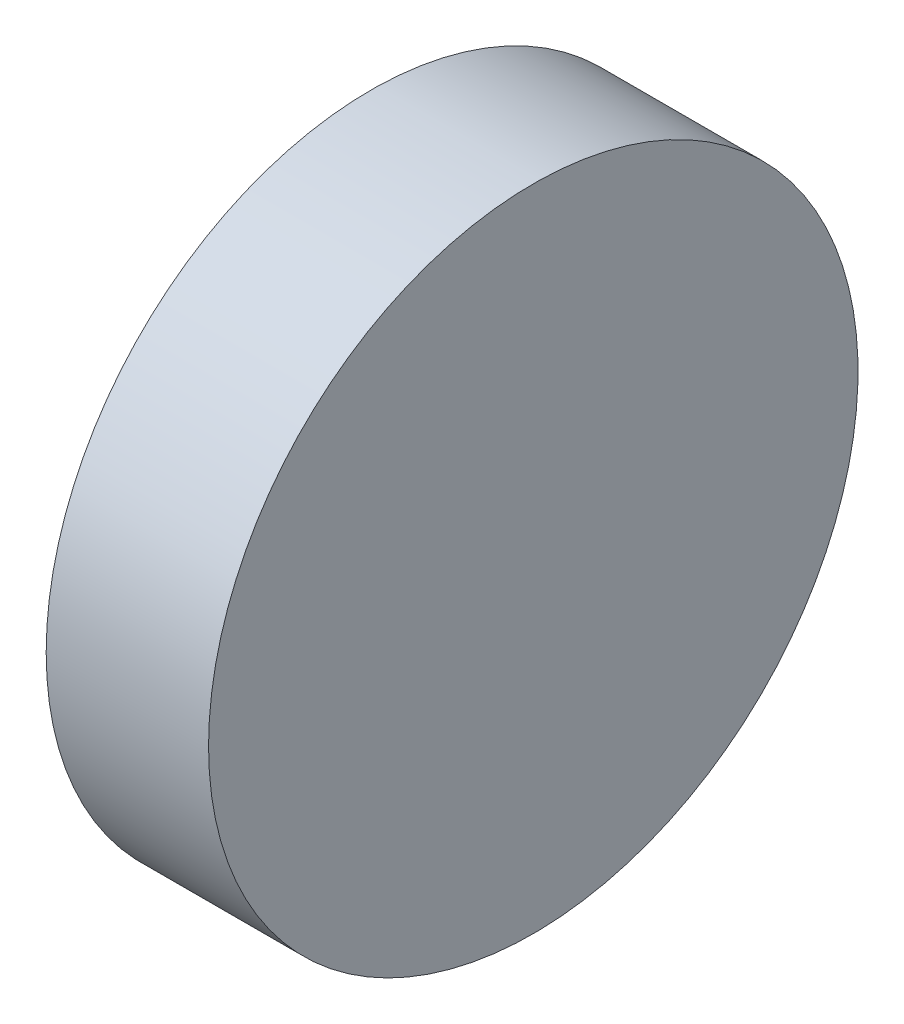
ISO-10303-21;
HEADER;
FILE_DESCRIPTION(('STEP AP214'),'2;1');
FILE_NAME('part.step','',(''),(''),'','','');
FILE_SCHEMA(('AUTOMOTIVE_DESIGN { 1 0 10303 214 1 1 1 1 }'));
ENDSEC;
DATA;
#1=APPLICATION_CONTEXT('core data for automotive mechanical design processes');
#2=APPLICATION_PROTOCOL_DEFINITION('international standard','automotive_design',2000,#1);
#3=PRODUCT_CONTEXT('',#1,'mechanical');
#4=PRODUCT('Part','Part','',(#3));
#5=PRODUCT_RELATED_PRODUCT_CATEGORY('part','',(#4));
#6=PRODUCT_DEFINITION_FORMATION('','',#4);
#7=PRODUCT_DEFINITION_CONTEXT('part definition',#1,'design');
#8=PRODUCT_DEFINITION('design','',#6,#7);
#9=PRODUCT_DEFINITION_SHAPE('','',#8);
#10=(LENGTH_UNIT() NAMED_UNIT(*) SI_UNIT(.MILLI.,.METRE.));
#11=(NAMED_UNIT(*) PLANE_ANGLE_UNIT() SI_UNIT($,.RADIAN.));
#12=(NAMED_UNIT(*) SI_UNIT($,.STERADIAN.) SOLID_ANGLE_UNIT());
#13=UNCERTAINTY_MEASURE_WITH_UNIT(LENGTH_MEASURE(1.E-05),#10,'distance_accuracy_value','');
#14=(GEOMETRIC_REPRESENTATION_CONTEXT(3) GLOBAL_UNCERTAINTY_ASSIGNED_CONTEXT((#13)) GLOBAL_UNIT_ASSIGNED_CONTEXT((#10,
#11,#12)) REPRESENTATION_CONTEXT('',''));
#15=CARTESIAN_POINT('',(0.,0.,0.));
#16=DIRECTION('',(0.,0.,1.));
#17=DIRECTION('',(1.,0.,0.));
#18=AXIS2_PLACEMENT_3D('',#15,#16,#17);
#19=CARTESIAN_POINT('',(-3.50000000000012,0.,7.75));
#20=DIRECTION('',(1.,0.,0.));
#21=DIRECTION('',(0.,0.,-1.));
#22=AXIS2_PLACEMENT_3D('',#19,#20,#21);
#23=CYLINDRICAL_SURFACE('',#22,3.);
#24=CARTESIAN_POINT('',(-3.50000000000012,0.,7.75));
#25=DIRECTION('',(-1.,0.,0.));
#26=DIRECTION('',(0.,0.,1.));
#27=AXIS2_PLACEMENT_3D('',#24,#25,#26);
#28=CIRCLE('',#27,3.);
#29=CARTESIAN_POINT('',(-3.50000000000012,0.,10.75));
#30=VERTEX_POINT('',#29);
#31=EDGE_CURVE('E10',#30,#30,#28,.T.);
#32=ORIENTED_EDGE('',*,*,#31,.F.);
#33=EDGE_LOOP('',(#32));
#34=FACE_BOUND('',#33,.T.);
#35=CARTESIAN_POINT('',(-2.00000000000012,0.,7.75));
#36=DIRECTION('',(-1.,0.,0.));
#37=DIRECTION('',(0.,0.,1.));
#38=AXIS2_PLACEMENT_3D('',#35,#36,#37);
#39=CIRCLE('',#38,3.);
#40=CARTESIAN_POINT('',(-2.00000000000012,0.,10.75));
#41=VERTEX_POINT('',#40);
#42=EDGE_CURVE('E44',#41,#41,#39,.T.);
#43=ORIENTED_EDGE('',*,*,#42,.T.);
#44=EDGE_LOOP('',(#43));
#45=FACE_BOUND('',#44,.T.);
#46=ADVANCED_FACE('F41',(#34,#45),#23,.T.);
#47=CARTESIAN_POINT('',(-3.50000000000012,0.,7.75));
#48=DIRECTION('',(-1.,0.,0.));
#49=DIRECTION('',(0.,0.,1.));
#50=AXIS2_PLACEMENT_3D('',#47,#48,#49);
#51=PLANE('',#50);
#52=CARTESIAN_POINT('',(-3.50000000000013,0.,7.75));
#53=DIRECTION('',(-1.,0.,0.));
#54=DIRECTION('',(0.,0.,1.));
#55=AXIS2_PLACEMENT_3D('',#52,#53,#54);
#56=CIRCLE('',#55,0.500000000000001);
#57=CARTESIAN_POINT('',(-3.50000000000013,0.,8.25));
#58=VERTEX_POINT('',#57);
#59=EDGE_CURVE('E51',#58,#58,#56,.T.);
#60=ORIENTED_EDGE('',*,*,#59,.F.);
#61=EDGE_LOOP('',(#60));
#62=FACE_BOUND('',#61,.T.);
#63=ORIENTED_EDGE('',*,*,#31,.T.);
#64=EDGE_LOOP('',(#63));
#65=FACE_BOUND('',#64,.T.);
#66=ADVANCED_FACE('F72',(#62,#65),#51,.T.);
#67=CARTESIAN_POINT('',(-2.00000000000012,0.,7.75));
#68=DIRECTION('',(-1.,0.,0.));
#69=DIRECTION('',(0.,0.,1.));
#70=AXIS2_PLACEMENT_3D('',#67,#68,#69);
#71=PLANE('',#70);
#72=ORIENTED_EDGE('',*,*,#42,.F.);
#73=EDGE_LOOP('',(#72));
#74=FACE_BOUND('',#73,.T.);
#75=ADVANCED_FACE('F63',(#74),#71,.F.);
#76=CARTESIAN_POINT('',(-5.00000000000012,0.,7.75));
#77=DIRECTION('',(1.,0.,0.));
#78=DIRECTION('',(0.,0.,-1.));
#79=AXIS2_PLACEMENT_3D('',#76,#77,#78);
#80=CYLINDRICAL_SURFACE('',#79,0.500000000000002);
#81=ORIENTED_EDGE('',*,*,#59,.T.);
#82=EDGE_LOOP('',(#81));
#83=FACE_BOUND('',#82,.T.);
#84=CARTESIAN_POINT('',(-5.00000000000012,0.,7.75));
#85=DIRECTION('',(-1.,0.,0.));
#86=DIRECTION('',(0.,0.,1.));
#87=AXIS2_PLACEMENT_3D('',#84,#85,#86);
#88=CIRCLE('',#87,0.500000000000002);
#89=CARTESIAN_POINT('',(-5.00000000000012,0.,8.25));
#90=VERTEX_POINT('',#89);
#91=EDGE_CURVE('E55',#90,#90,#88,.T.);
#92=ORIENTED_EDGE('',*,*,#91,.F.);
#93=EDGE_LOOP('',(#92));
#94=FACE_BOUND('',#93,.T.);
#95=ADVANCED_FACE('F61',(#83,#94),#80,.T.);
#96=CARTESIAN_POINT('',(-5.00000000000012,0.,7.75));
#97=DIRECTION('',(-1.,0.,0.));
#98=DIRECTION('',(0.,0.,1.));
#99=AXIS2_PLACEMENT_3D('',#96,#97,#98);
#100=PLANE('',#99);
#101=ORIENTED_EDGE('',*,*,#91,.T.);
#102=EDGE_LOOP('',(#101));
#103=FACE_BOUND('',#102,.T.);
#104=ADVANCED_FACE('F59',(#103),#100,.T.);
#105=CLOSED_SHELL('',(#46,#66,#75,#95,#104));
#106=MANIFOLD_SOLID_BREP('B2',#105);
#107=ADVANCED_BREP_SHAPE_REPRESENTATION('',(#18,#106),#14);
#108=SHAPE_DEFINITION_REPRESENTATION(#9,#107);
ENDSEC;
END-ISO-10303-21;
